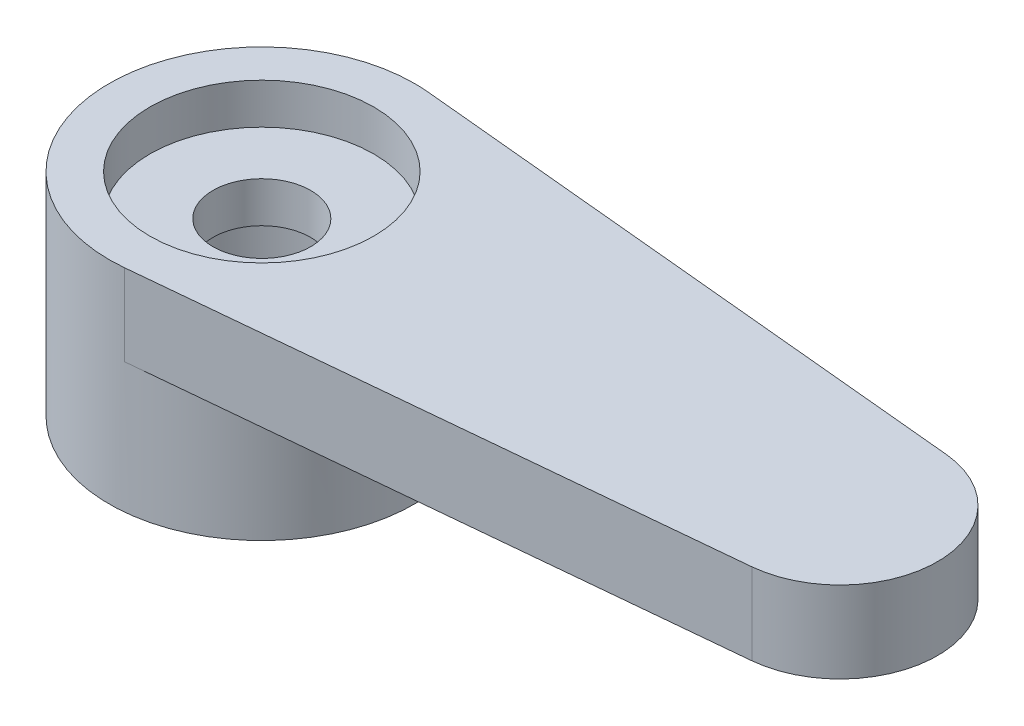
ISO-10303-21;
HEADER;
FILE_DESCRIPTION(('STEP AP214'),'2;1');
FILE_NAME('part.step','',(''),(''),'','','');
FILE_SCHEMA(('AUTOMOTIVE_DESIGN { 1 0 10303 214 1 1 1 1 }'));
ENDSEC;
DATA;
#1=APPLICATION_CONTEXT('core data for automotive mechanical design processes');
#2=APPLICATION_PROTOCOL_DEFINITION('international standard','automotive_design',2000,#1);
#3=PRODUCT_CONTEXT('',#1,'mechanical');
#4=PRODUCT('Part','Part','',(#3));
#5=PRODUCT_RELATED_PRODUCT_CATEGORY('part','',(#4));
#6=PRODUCT_DEFINITION_FORMATION('','',#4);
#7=PRODUCT_DEFINITION_CONTEXT('part definition',#1,'design');
#8=PRODUCT_DEFINITION('design','',#6,#7);
#9=PRODUCT_DEFINITION_SHAPE('','',#8);
#10=(LENGTH_UNIT() NAMED_UNIT(*) SI_UNIT(.MILLI.,.METRE.));
#11=(NAMED_UNIT(*) PLANE_ANGLE_UNIT() SI_UNIT($,.RADIAN.));
#12=(NAMED_UNIT(*) SI_UNIT($,.STERADIAN.) SOLID_ANGLE_UNIT());
#13=UNCERTAINTY_MEASURE_WITH_UNIT(LENGTH_MEASURE(1.E-05),#10,'distance_accuracy_value','');
#14=(GEOMETRIC_REPRESENTATION_CONTEXT(3) GLOBAL_UNCERTAINTY_ASSIGNED_CONTEXT((#13)) GLOBAL_UNIT_ASSIGNED_CONTEXT((#10,
#11,#12)) REPRESENTATION_CONTEXT('',''));
#15=CARTESIAN_POINT('',(0.,0.,0.));
#16=DIRECTION('',(0.,0.,1.));
#17=DIRECTION('',(1.,0.,0.));
#18=AXIS2_PLACEMENT_3D('',#15,#16,#17);
#19=CARTESIAN_POINT('',(0.,2.,0.));
#20=DIRECTION('',(0.,-1.,0.));
#21=DIRECTION('',(0.,0.,-1.));
#22=AXIS2_PLACEMENT_3D('',#19,#20,#21);
#23=CYLINDRICAL_SURFACE('',#22,1.2);
#24=CARTESIAN_POINT('',(0.,0.,0.));
#25=DIRECTION('',(0.,1.,0.));
#26=DIRECTION('',(0.,0.,1.));
#27=AXIS2_PLACEMENT_3D('',#24,#25,#26);
#28=CIRCLE('',#27,1.2);
#29=CARTESIAN_POINT('',(0.,0.,1.2));
#30=VERTEX_POINT('',#29);
#31=EDGE_CURVE('E93',#30,#30,#28,.T.);
#32=ORIENTED_EDGE('',*,*,#31,.F.);
#33=EDGE_LOOP('',(#32));
#34=FACE_BOUND('',#33,.T.);
#35=CARTESIAN_POINT('',(0.,1.,0.));
#36=DIRECTION('',(0.,1.,0.));
#37=DIRECTION('',(0.,0.,1.));
#38=AXIS2_PLACEMENT_3D('',#35,#36,#37);
#39=CIRCLE('',#38,1.2);
#40=CARTESIAN_POINT('',(0.,1.,1.2));
#41=VERTEX_POINT('',#40);
#42=EDGE_CURVE('E42',#41,#41,#39,.T.);
#43=ORIENTED_EDGE('',*,*,#42,.T.);
#44=EDGE_LOOP('',(#43));
#45=FACE_BOUND('',#44,.T.);
#46=ADVANCED_FACE('F38',(#34,#45),#23,.F.);
#47=CARTESIAN_POINT('',(14.2,0.,0.));
#48=DIRECTION('',(0.,1.,0.));
#49=DIRECTION('',(0.,0.,1.));
#50=AXIS2_PLACEMENT_3D('',#47,#48,#49);
#51=PLANE('',#50);
#52=CARTESIAN_POINT('',(0.,0.,0.));
#53=DIRECTION('',(0.,-1.,0.));
#54=DIRECTION('',(0.,0.,-1.));
#55=AXIS2_PLACEMENT_3D('',#52,#53,#54);
#56=CIRCLE('',#55,3.75);
#57=CARTESIAN_POINT('',(0.356514084507042,0.,-3.73301456031826));
#58=VERTEX_POINT('',#57);
#59=CARTESIAN_POINT('',(0.356514084507044,0.,3.73301456031826));
#60=VERTEX_POINT('',#59);
#61=EDGE_CURVE('E72',#58,#60,#56,.T.);
#62=ORIENTED_EDGE('',*,*,#61,.F.);
#63=DIRECTION('',(-0.995470549418202,0.,-0.0950704225352113));
#64=VECTOR('',#63,1.);
#65=CARTESIAN_POINT('',(0.356514084507042,0.,-3.73301456031826));
#66=LINE('',#65,#64);
#67=CARTESIAN_POINT('',(14.4281690140845,0.,-2.38912931860368));
#68=VERTEX_POINT('',#67);
#69=EDGE_CURVE('E91',#68,#58,#66,.T.);
#70=ORIENTED_EDGE('',*,*,#69,.F.);
#71=CARTESIAN_POINT('',(14.2,0.,0.));
#72=DIRECTION('',(0.,1.,0.));
#73=DIRECTION('',(0.,0.,1.));
#74=AXIS2_PLACEMENT_3D('',#71,#72,#73);
#75=CIRCLE('',#74,2.4);
#76=CARTESIAN_POINT('',(14.4281690140845,0.,2.38912931860368));
#77=VERTEX_POINT('',#76);
#78=EDGE_CURVE('E99',#77,#68,#75,.T.);
#79=ORIENTED_EDGE('',*,*,#78,.F.);
#80=DIRECTION('',(0.995470549418202,0.,-0.0950704225352114));
#81=VECTOR('',#80,1.);
#82=CARTESIAN_POINT('',(0.356514084507042,0.,3.73301456031826));
#83=LINE('',#82,#81);
#84=EDGE_CURVE('E78',#60,#77,#83,.T.);
#85=ORIENTED_EDGE('',*,*,#84,.F.);
#86=EDGE_LOOP('',(#62,#70,#79,#85));
#87=FACE_BOUND('',#86,.T.);
#88=ADVANCED_FACE('F89',(#87),#51,.F.);
#89=CARTESIAN_POINT('',(14.2,2.,0.));
#90=DIRECTION('',(0.,1.,0.));
#91=DIRECTION('',(0.,0.,1.));
#92=AXIS2_PLACEMENT_3D('',#89,#90,#91);
#93=PLANE('',#92);
#94=CARTESIAN_POINT('',(0.,2.,0.));
#95=DIRECTION('',(0.,1.,0.));
#96=DIRECTION('',(0.,0.,1.));
#97=AXIS2_PLACEMENT_3D('',#94,#95,#96);
#98=CIRCLE('',#97,2.75);
#99=CARTESIAN_POINT('',(0.,2.,2.75));
#100=VERTEX_POINT('',#99);
#101=EDGE_CURVE('E162',#100,#100,#98,.T.);
#102=ORIENTED_EDGE('',*,*,#101,.F.);
#103=EDGE_LOOP('',(#102));
#104=FACE_BOUND('',#103,.T.);
#105=CARTESIAN_POINT('',(14.2,2.,0.));
#106=DIRECTION('',(0.,1.,0.));
#107=DIRECTION('',(0.,0.,1.));
#108=AXIS2_PLACEMENT_3D('',#105,#106,#107);
#109=CIRCLE('',#108,2.4);
#110=CARTESIAN_POINT('',(14.4281690140845,2.,2.38912931860368));
#111=VERTEX_POINT('',#110);
#112=CARTESIAN_POINT('',(14.4281690140845,2.,-2.38912931860368));
#113=VERTEX_POINT('',#112);
#114=EDGE_CURVE('E124',#111,#113,#109,.T.);
#115=ORIENTED_EDGE('',*,*,#114,.T.);
#116=DIRECTION('',(-0.995470549418202,0.,-0.0950704225352113));
#117=VECTOR('',#116,1.);
#118=CARTESIAN_POINT('',(0.356514084507042,2.,-3.73301456031826));
#119=LINE('',#118,#117);
#120=CARTESIAN_POINT('',(0.356514084507042,2.,-3.73301456031826));
#121=VERTEX_POINT('',#120);
#122=EDGE_CURVE('E85',#113,#121,#119,.T.);
#123=ORIENTED_EDGE('',*,*,#122,.T.);
#124=CARTESIAN_POINT('',(0.,2.,0.));
#125=DIRECTION('',(0.,1.,0.));
#126=DIRECTION('',(0.,0.,1.));
#127=AXIS2_PLACEMENT_3D('',#124,#125,#126);
#128=CIRCLE('',#127,3.75);
#129=CARTESIAN_POINT('',(0.356514084507044,2.,3.73301456031826));
#130=VERTEX_POINT('',#129);
#131=EDGE_CURVE('E103',#121,#130,#128,.T.);
#132=ORIENTED_EDGE('',*,*,#131,.T.);
#133=DIRECTION('',(0.995470549418202,0.,-0.0950704225352114));
#134=VECTOR('',#133,1.);
#135=CARTESIAN_POINT('',(0.356514084507042,2.,3.73301456031826));
#136=LINE('',#135,#134);
#137=EDGE_CURVE('E57',#130,#111,#136,.T.);
#138=ORIENTED_EDGE('',*,*,#137,.T.);
#139=EDGE_LOOP('',(#115,#123,#132,#138));
#140=FACE_BOUND('',#139,.T.);
#141=ADVANCED_FACE('F151',(#104,#140),#93,.T.);
#142=CARTESIAN_POINT('',(14.2,2.,0.));
#143=DIRECTION('',(0.,-1.,0.));
#144=DIRECTION('',(0.,0.,-1.));
#145=AXIS2_PLACEMENT_3D('',#142,#143,#144);
#146=CYLINDRICAL_SURFACE('',#145,2.4);
#147=ORIENTED_EDGE('',*,*,#78,.T.);
#148=DIRECTION('',(0.,-1.,0.));
#149=VECTOR('',#148,1.);
#150=CARTESIAN_POINT('',(14.4281690140845,2.,-2.38912931860368));
#151=LINE('',#150,#149);
#152=EDGE_CURVE('E11',#113,#68,#151,.T.);
#153=ORIENTED_EDGE('',*,*,#152,.F.);
#154=ORIENTED_EDGE('',*,*,#114,.F.);
#155=DIRECTION('',(0.,-1.,0.));
#156=VECTOR('',#155,1.);
#157=CARTESIAN_POINT('',(14.4281690140845,2.,2.38912931860368));
#158=LINE('',#157,#156);
#159=EDGE_CURVE('E106',#111,#77,#158,.T.);
#160=ORIENTED_EDGE('',*,*,#159,.T.);
#161=EDGE_LOOP('',(#147,#153,#154,#160));
#162=FACE_BOUND('',#161,.T.);
#163=ADVANCED_FACE('F40',(#162),#146,.T.);
#164=CARTESIAN_POINT('',(0.356514084507042,2.,-3.73301456031826));
#165=DIRECTION('',(-0.0950704225352113,0.,0.995470549418202));
#166=DIRECTION('',(0.995470549418202,0.,0.0950704225352113));
#167=AXIS2_PLACEMENT_3D('',#164,#165,#166);
#168=PLANE('',#167);
#169=ORIENTED_EDGE('',*,*,#69,.T.);
#170=DIRECTION('',(0.,-1.,0.));
#171=VECTOR('',#170,1.);
#172=CARTESIAN_POINT('',(0.356514084507042,2.,-3.73301456031826));
#173=LINE('',#172,#171);
#174=EDGE_CURVE('E48',#121,#58,#173,.T.);
#175=ORIENTED_EDGE('',*,*,#174,.F.);
#176=ORIENTED_EDGE('',*,*,#122,.F.);
#177=ORIENTED_EDGE('',*,*,#152,.T.);
#178=EDGE_LOOP('',(#169,#175,#176,#177));
#179=FACE_BOUND('',#178,.T.);
#180=ADVANCED_FACE('F95',(#179),#168,.F.);
#181=CARTESIAN_POINT('',(0.,2.,0.));
#182=DIRECTION('',(0.,-1.,0.));
#183=DIRECTION('',(0.,0.,-1.));
#184=AXIS2_PLACEMENT_3D('',#181,#182,#183);
#185=CYLINDRICAL_SURFACE('',#184,3.75);
#186=ORIENTED_EDGE('',*,*,#174,.T.);
#187=ORIENTED_EDGE('',*,*,#61,.T.);
#188=DIRECTION('',(0.,-1.,0.));
#189=VECTOR('',#188,1.);
#190=CARTESIAN_POINT('',(0.356514084507044,2.,3.73301456031826));
#191=LINE('',#190,#189);
#192=EDGE_CURVE('E104',#130,#60,#191,.T.);
#193=ORIENTED_EDGE('',*,*,#192,.F.);
#194=ORIENTED_EDGE('',*,*,#131,.F.);
#195=EDGE_LOOP('',(#186,#187,#193,#194));
#196=FACE_BOUND('',#195,.T.);
#197=CARTESIAN_POINT('',(0.,-3.2,0.));
#198=DIRECTION('',(0.,-1.,0.));
#199=DIRECTION('',(0.,0.,-1.));
#200=AXIS2_PLACEMENT_3D('',#197,#198,#199);
#201=CIRCLE('',#200,3.75);
#202=CARTESIAN_POINT('',(0.,-3.2,-3.75));
#203=VERTEX_POINT('',#202);
#204=EDGE_CURVE('E92',#203,#203,#201,.T.);
#205=ORIENTED_EDGE('',*,*,#204,.F.);
#206=EDGE_LOOP('',(#205));
#207=FACE_BOUND('',#206,.T.);
#208=ADVANCED_FACE('F101',(#196,#207),#185,.T.);
#209=CARTESIAN_POINT('',(0.356514084507042,2.,3.73301456031826));
#210=DIRECTION('',(-0.0950704225352114,0.,-0.995470549418202));
#211=DIRECTION('',(-0.995470549418202,0.,0.0950704225352114));
#212=AXIS2_PLACEMENT_3D('',#209,#210,#211);
#213=PLANE('',#212);
#214=ORIENTED_EDGE('',*,*,#84,.T.);
#215=ORIENTED_EDGE('',*,*,#159,.F.);
#216=ORIENTED_EDGE('',*,*,#137,.F.);
#217=ORIENTED_EDGE('',*,*,#192,.T.);
#218=EDGE_LOOP('',(#214,#215,#216,#217));
#219=FACE_BOUND('',#218,.T.);
#220=ADVANCED_FACE('F132',(#219),#213,.F.);
#221=CARTESIAN_POINT('',(0.,-3.2,0.));
#222=DIRECTION('',(0.,-1.,0.));
#223=DIRECTION('',(0.,0.,-1.));
#224=AXIS2_PLACEMENT_3D('',#221,#222,#223);
#225=PLANE('',#224);
#226=CARTESIAN_POINT('',(0.,-3.2,0.));
#227=DIRECTION('',(0.,-1.,0.));
#228=DIRECTION('',(0.,0.,-1.));
#229=AXIS2_PLACEMENT_3D('',#226,#227,#228);
#230=CIRCLE('',#229,2.4);
#231=CARTESIAN_POINT('',(0.,-3.2,-2.4));
#232=VERTEX_POINT('',#231);
#233=EDGE_CURVE('E114',#232,#232,#230,.T.);
#234=ORIENTED_EDGE('',*,*,#233,.F.);
#235=EDGE_LOOP('',(#234));
#236=FACE_BOUND('',#235,.T.);
#237=ORIENTED_EDGE('',*,*,#204,.T.);
#238=EDGE_LOOP('',(#237));
#239=FACE_BOUND('',#238,.T.);
#240=ADVANCED_FACE('F134',(#236,#239),#225,.T.);
#241=CARTESIAN_POINT('',(14.2,0.,0.));
#242=DIRECTION('',(0.,1.,0.));
#243=DIRECTION('',(0.,0.,1.));
#244=AXIS2_PLACEMENT_3D('',#241,#242,#243);
#245=PLANE('',#244);
#246=ORIENTED_EDGE('',*,*,#31,.T.);
#247=EDGE_LOOP('',(#246));
#248=FACE_BOUND('',#247,.T.);
#249=CARTESIAN_POINT('',(0.,0.,0.));
#250=DIRECTION('',(0.,1.,0.));
#251=DIRECTION('',(0.,0.,1.));
#252=AXIS2_PLACEMENT_3D('',#249,#250,#251);
#253=CIRCLE('',#252,2.4);
#254=CARTESIAN_POINT('',(0.,0.,-2.4));
#255=VERTEX_POINT('',#254);
#256=EDGE_CURVE('E110',#255,#255,#253,.F.);
#257=ORIENTED_EDGE('',*,*,#256,.T.);
#258=EDGE_LOOP('',(#257));
#259=FACE_BOUND('',#258,.T.);
#260=ADVANCED_FACE('F140',(#248,#259),#245,.F.);
#261=CARTESIAN_POINT('',(0.,6.78822509939086,0.));
#262=DIRECTION('',(0.,-1.,0.));
#263=DIRECTION('',(0.,0.,-1.));
#264=AXIS2_PLACEMENT_3D('',#261,#262,#263);
#265=CYLINDRICAL_SURFACE('',#264,2.4);
#266=CARTESIAN_POINT('',(0.,-3.2,-2.4));
#267=CARTESIAN_POINT('',(0.,-3.16666666666667,-2.4));
#268=CARTESIAN_POINT('',(0.,-3.13333333333334,-2.4));
#269=CARTESIAN_POINT('',(0.,-3.06666666666667,-2.4));
#270=CARTESIAN_POINT('',(0.,-3.03333333333333,-2.4));
#271=CARTESIAN_POINT('',(0.,-2.96666666666667,-2.4));
#272=CARTESIAN_POINT('',(0.,-2.93333333333333,-2.4));
#273=CARTESIAN_POINT('',(0.,-2.86666666666667,-2.4));
#274=CARTESIAN_POINT('',(0.,-2.83333333333333,-2.4));
#275=CARTESIAN_POINT('',(0.,-2.76666666666667,-2.4));
#276=CARTESIAN_POINT('',(0.,-2.73333333333333,-2.4));
#277=CARTESIAN_POINT('',(0.,-2.66666666666667,-2.4));
#278=CARTESIAN_POINT('',(0.,-2.63333333333333,-2.4));
#279=CARTESIAN_POINT('',(0.,-2.56666666666667,-2.4));
#280=CARTESIAN_POINT('',(0.,-2.53333333333333,-2.4));
#281=CARTESIAN_POINT('',(0.,-2.46666666666667,-2.4));
#282=CARTESIAN_POINT('',(0.,-2.43333333333333,-2.4));
#283=CARTESIAN_POINT('',(0.,-2.36666666666667,-2.4));
#284=CARTESIAN_POINT('',(0.,-2.33333333333333,-2.4));
#285=CARTESIAN_POINT('',(0.,-2.26666666666667,-2.4));
#286=CARTESIAN_POINT('',(0.,-2.23333333333333,-2.4));
#287=CARTESIAN_POINT('',(0.,-2.16666666666667,-2.4));
#288=CARTESIAN_POINT('',(0.,-2.13333333333333,-2.4));
#289=CARTESIAN_POINT('',(0.,-2.06666666666667,-2.4));
#290=CARTESIAN_POINT('',(0.,-2.03333333333333,-2.4));
#291=CARTESIAN_POINT('',(0.,-1.96666666666667,-2.4));
#292=CARTESIAN_POINT('',(0.,-1.93333333333333,-2.4));
#293=CARTESIAN_POINT('',(0.,-1.86666666666667,-2.4));
#294=CARTESIAN_POINT('',(0.,-1.83333333333333,-2.4));
#295=CARTESIAN_POINT('',(0.,-1.76666666666667,-2.4));
#296=CARTESIAN_POINT('',(0.,-1.73333333333333,-2.4));
#297=CARTESIAN_POINT('',(0.,-1.66666666666667,-2.4));
#298=CARTESIAN_POINT('',(0.,-1.63333333333333,-2.4));
#299=CARTESIAN_POINT('',(0.,-1.56666666666667,-2.4));
#300=CARTESIAN_POINT('',(0.,-1.53333333333333,-2.4));
#301=CARTESIAN_POINT('',(0.,-1.46666666666667,-2.4));
#302=CARTESIAN_POINT('',(0.,-1.43333333333333,-2.4));
#303=CARTESIAN_POINT('',(0.,-1.36666666666667,-2.4));
#304=CARTESIAN_POINT('',(0.,-1.33333333333333,-2.4));
#305=CARTESIAN_POINT('',(0.,-1.26666666666667,-2.4));
#306=CARTESIAN_POINT('',(0.,-1.23333333333333,-2.4));
#307=CARTESIAN_POINT('',(0.,-1.16666666666667,-2.4));
#308=CARTESIAN_POINT('',(0.,-1.13333333333333,-2.4));
#309=CARTESIAN_POINT('',(0.,-1.06666666666667,-2.4));
#310=CARTESIAN_POINT('',(0.,-1.03333333333333,-2.4));
#311=CARTESIAN_POINT('',(0.,-0.966666666666668,-2.4));
#312=CARTESIAN_POINT('',(0.,-0.933333333333335,-2.4));
#313=CARTESIAN_POINT('',(0.,-0.866666666666668,-2.4));
#314=CARTESIAN_POINT('',(0.,-0.833333333333335,-2.4));
#315=CARTESIAN_POINT('',(0.,-0.766666666666668,-2.4));
#316=CARTESIAN_POINT('',(0.,-0.733333333333334,-2.4));
#317=CARTESIAN_POINT('',(0.,-0.666666666666668,-2.4));
#318=CARTESIAN_POINT('',(0.,-0.633333333333334,-2.4));
#319=CARTESIAN_POINT('',(0.,-0.566666666666668,-2.4));
#320=CARTESIAN_POINT('',(0.,-0.533333333333334,-2.4));
#321=CARTESIAN_POINT('',(0.,-0.466666666666668,-2.4));
#322=CARTESIAN_POINT('',(0.,-0.433333333333334,-2.4));
#323=CARTESIAN_POINT('',(0.,-0.366666666666668,-2.4));
#324=CARTESIAN_POINT('',(0.,-0.333333333333334,-2.4));
#325=CARTESIAN_POINT('',(0.,-0.266666666666668,-2.4));
#326=CARTESIAN_POINT('',(0.,-0.233333333333335,-2.4));
#327=CARTESIAN_POINT('',(0.,-0.166666666666668,-2.4));
#328=CARTESIAN_POINT('',(0.,-0.133333333333335,-2.4));
#329=CARTESIAN_POINT('',(0.,-0.0666666666666677,-2.4));
#330=CARTESIAN_POINT('',(0.,-0.0333333333333342,-2.4));
#331=CARTESIAN_POINT('',(0.,0.,-2.4));
#332=B_SPLINE_CURVE_WITH_KNOTS('',3,(#266,#267,#268,#269,#270,#271,#272,#273,#274,#275,#276,
#277,#278,#279,#280,#281,#282,#283,#284,#285,#286,#287,#288,#289,#290,#291,#292,#293,#294,#295,
#296,#297,#298,#299,#300,#301,#302,#303,#304,#305,#306,#307,#308,#309,#310,#311,#312,#313,#314,
#315,#316,#317,#318,#319,#320,#321,#322,#323,#324,#325,#326,#327,#328,#329,#330,#331),
.UNSPECIFIED.,.F.,.F.,(4,2,2,2,2,2,2,2,2,2,2,2,2,2,2,2,2,2,2,2,2,2,2,2,2,2,2,2,2,2,2,2,4),(0.,
0.0999999999999994,0.200000000000001,0.3,0.400000000000001,0.5,0.6,0.700000000000001,0.8,0.9,1.,
1.1,1.2,1.3,1.4,1.5,1.6,1.7,1.8,1.9,2.,2.1,2.2,2.3,2.4,2.5,2.6,2.7,2.8,2.9,3.,3.1,3.2),.UNSPECIFIED.);
#333=EDGE_CURVE('BSEAM179',#232,#255,#332,.T.);
#334=ORIENTED_EDGE('',*,*,#233,.T.);
#335=ORIENTED_EDGE('',*,*,#256,.F.);
#336=ORIENTED_EDGE('',*,*,#333,.T.);
#337=ORIENTED_EDGE('',*,*,#333,.F.);
#338=EDGE_LOOP('',(#334,#336,#335,#337));
#339=FACE_BOUND('',#338,.T.);
#340=ADVANCED_FACE('F179',(#339),#265,.F.);
#341=CARTESIAN_POINT('',(0.,1.,0.));
#342=DIRECTION('',(0.,1.,0.));
#343=DIRECTION('',(0.,0.,1.));
#344=AXIS2_PLACEMENT_3D('',#341,#342,#343);
#345=CYLINDRICAL_SURFACE('',#344,2.75);
#346=CARTESIAN_POINT('',(0.,1.,0.));
#347=DIRECTION('',(0.,1.,0.));
#348=DIRECTION('',(0.,0.,1.));
#349=AXIS2_PLACEMENT_3D('',#346,#347,#348);
#350=CIRCLE('',#349,2.75);
#351=CARTESIAN_POINT('',(0.,1.,2.75));
#352=VERTEX_POINT('',#351);
#353=EDGE_CURVE('E164',#352,#352,#350,.T.);
#354=ORIENTED_EDGE('',*,*,#353,.F.);
#355=EDGE_LOOP('',(#354));
#356=FACE_BOUND('',#355,.T.);
#357=ORIENTED_EDGE('',*,*,#101,.T.);
#358=EDGE_LOOP('',(#357));
#359=FACE_BOUND('',#358,.T.);
#360=ADVANCED_FACE('F174',(#356,#359),#345,.F.);
#361=CARTESIAN_POINT('',(0.,1.,0.));
#362=DIRECTION('',(0.,1.,0.));
#363=DIRECTION('',(0.,0.,1.));
#364=AXIS2_PLACEMENT_3D('',#361,#362,#363);
#365=PLANE('',#364);
#366=ORIENTED_EDGE('',*,*,#42,.F.);
#367=EDGE_LOOP('',(#366));
#368=FACE_BOUND('',#367,.T.);
#369=ORIENTED_EDGE('',*,*,#353,.T.);
#370=EDGE_LOOP('',(#369));
#371=FACE_BOUND('',#370,.T.);
#372=ADVANCED_FACE('F172',(#368,#371),#365,.T.);
#373=CLOSED_SHELL('',(#46,#88,#141,#163,#180,#208,#220,#240,#260,#340,#360,#372));
#374=MANIFOLD_SOLID_BREP('B2',#373);
#375=ADVANCED_BREP_SHAPE_REPRESENTATION('',(#18,#374),#14);
#376=SHAPE_DEFINITION_REPRESENTATION(#9,#375);
ENDSEC;
END-ISO-10303-21;
